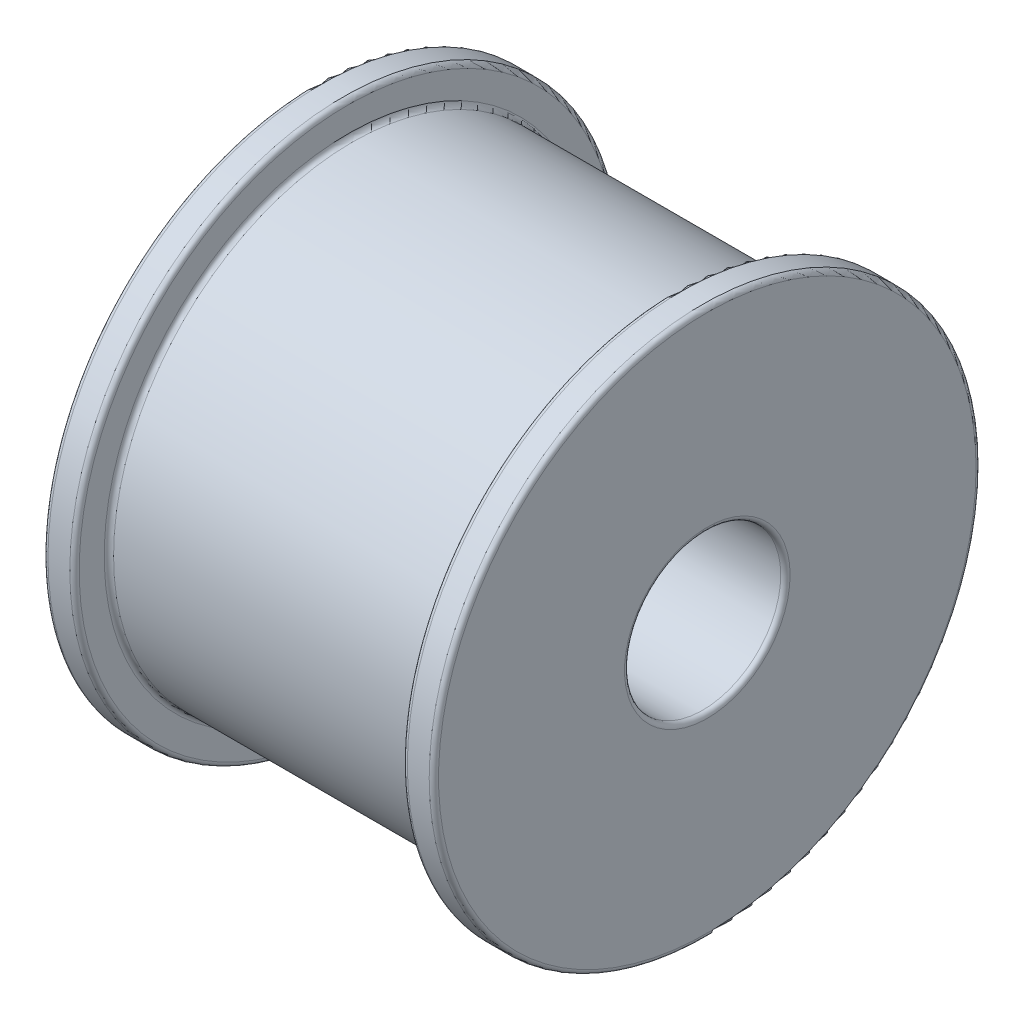
ISO-10303-21;
HEADER;
FILE_DESCRIPTION(('STEP AP214'),'2;1');
FILE_NAME('part.step','',(''),(''),'','','');
FILE_SCHEMA(('AUTOMOTIVE_DESIGN { 1 0 10303 214 1 1 1 1 }'));
ENDSEC;
DATA;
#1=APPLICATION_CONTEXT('core data for automotive mechanical design processes');
#2=APPLICATION_PROTOCOL_DEFINITION('international standard','automotive_design',2000,#1);
#3=PRODUCT_CONTEXT('',#1,'mechanical');
#4=PRODUCT('Part','Part','',(#3));
#5=PRODUCT_RELATED_PRODUCT_CATEGORY('part','',(#4));
#6=PRODUCT_DEFINITION_FORMATION('','',#4);
#7=PRODUCT_DEFINITION_CONTEXT('part definition',#1,'design');
#8=PRODUCT_DEFINITION('design','',#6,#7);
#9=PRODUCT_DEFINITION_SHAPE('','',#8);
#10=(LENGTH_UNIT() NAMED_UNIT(*) SI_UNIT(.MILLI.,.METRE.));
#11=(NAMED_UNIT(*) PLANE_ANGLE_UNIT() SI_UNIT($,.RADIAN.));
#12=(NAMED_UNIT(*) SI_UNIT($,.STERADIAN.) SOLID_ANGLE_UNIT());
#13=UNCERTAINTY_MEASURE_WITH_UNIT(LENGTH_MEASURE(1.E-05),#10,'distance_accuracy_value','');
#14=(GEOMETRIC_REPRESENTATION_CONTEXT(3) GLOBAL_UNCERTAINTY_ASSIGNED_CONTEXT((#13)) GLOBAL_UNIT_ASSIGNED_CONTEXT((#10,
#11,#12)) REPRESENTATION_CONTEXT('',''));
#15=CARTESIAN_POINT('',(0.,0.,0.));
#16=DIRECTION('',(0.,0.,1.));
#17=DIRECTION('',(1.,0.,0.));
#18=AXIS2_PLACEMENT_3D('',#15,#16,#17);
#19=CARTESIAN_POINT('',(2.,0.,0.));
#20=DIRECTION('',(-1.,0.,0.));
#21=DIRECTION('',(0.,0.,1.));
#22=AXIS2_PLACEMENT_3D('',#19,#20,#21);
#23=CYLINDRICAL_SURFACE('',#22,17.5);
#24=CARTESIAN_POINT('',(1.7,0.,0.));
#25=DIRECTION('',(1.,0.,0.));
#26=DIRECTION('',(0.,0.,-1.));
#27=AXIS2_PLACEMENT_3D('',#24,#25,#26);
#28=CIRCLE('',#27,17.5);
#29=CARTESIAN_POINT('',(1.7,0.,-17.5));
#30=VERTEX_POINT('',#29);
#31=EDGE_CURVE('E10',#30,#30,#28,.F.);
#32=ORIENTED_EDGE('',*,*,#31,.T.);
#33=EDGE_LOOP('',(#32));
#34=FACE_BOUND('',#33,.T.);
#35=CARTESIAN_POINT('',(0.3,0.,0.));
#36=DIRECTION('',(1.,0.,0.));
#37=DIRECTION('',(0.,0.,-1.));
#38=AXIS2_PLACEMENT_3D('',#35,#36,#37);
#39=CIRCLE('',#38,17.5);
#40=CARTESIAN_POINT('',(0.3,0.,-17.5));
#41=VERTEX_POINT('',#40);
#42=EDGE_CURVE('E41',#41,#41,#39,.T.);
#43=ORIENTED_EDGE('',*,*,#42,.T.);
#44=EDGE_LOOP('',(#43));
#45=FACE_BOUND('',#44,.T.);
#46=ADVANCED_FACE('F34',(#34,#45),#23,.T.);
#47=CARTESIAN_POINT('',(2.,0.,0.));
#48=DIRECTION('',(1.,0.,0.));
#49=DIRECTION('',(0.,0.,-1.));
#50=AXIS2_PLACEMENT_3D('',#47,#48,#49);
#51=PLANE('',#50);
#52=CARTESIAN_POINT('',(2.,0.,0.));
#53=DIRECTION('',(1.,0.,0.));
#54=DIRECTION('',(0.,0.,-1.));
#55=AXIS2_PLACEMENT_3D('',#52,#53,#54);
#56=CIRCLE('',#55,15.6);
#57=CARTESIAN_POINT('',(2.,0.,-15.6));
#58=VERTEX_POINT('',#57);
#59=EDGE_CURVE('E78',#58,#58,#56,.F.);
#60=ORIENTED_EDGE('',*,*,#59,.T.);
#61=EDGE_LOOP('',(#60));
#62=FACE_BOUND('',#61,.T.);
#63=CARTESIAN_POINT('',(2.,0.,0.));
#64=DIRECTION('',(1.,0.,0.));
#65=DIRECTION('',(0.,0.,-1.));
#66=AXIS2_PLACEMENT_3D('',#63,#64,#65);
#67=CIRCLE('',#66,17.2);
#68=CARTESIAN_POINT('',(2.,0.,-17.2));
#69=VERTEX_POINT('',#68);
#70=EDGE_CURVE('E81',#69,#69,#67,.T.);
#71=ORIENTED_EDGE('',*,*,#70,.T.);
#72=EDGE_LOOP('',(#71));
#73=FACE_BOUND('',#72,.T.);
#74=ADVANCED_FACE('F131',(#62,#73),#51,.T.);
#75=CARTESIAN_POINT('',(0.,0.,0.));
#76=DIRECTION('',(1.,0.,0.));
#77=DIRECTION('',(0.,0.,-1.));
#78=AXIS2_PLACEMENT_3D('',#75,#76,#77);
#79=PLANE('',#78);
#80=CARTESIAN_POINT('',(0.,0.,0.));
#81=DIRECTION('',(1.,0.,0.));
#82=DIRECTION('',(0.,0.,-1.));
#83=AXIS2_PLACEMENT_3D('',#80,#81,#82);
#84=CIRCLE('',#83,5.3);
#85=CARTESIAN_POINT('',(0.,0.,-5.3));
#86=VERTEX_POINT('',#85);
#87=EDGE_CURVE('E66',#86,#86,#84,.T.);
#88=ORIENTED_EDGE('',*,*,#87,.T.);
#89=EDGE_LOOP('',(#88));
#90=FACE_BOUND('',#89,.T.);
#91=CARTESIAN_POINT('',(0.,0.,0.));
#92=DIRECTION('',(1.,0.,0.));
#93=DIRECTION('',(0.,0.,-1.));
#94=AXIS2_PLACEMENT_3D('',#91,#92,#93);
#95=CIRCLE('',#94,17.2);
#96=CARTESIAN_POINT('',(0.,0.,-17.2));
#97=VERTEX_POINT('',#96);
#98=EDGE_CURVE('E69',#97,#97,#95,.F.);
#99=ORIENTED_EDGE('',*,*,#98,.T.);
#100=EDGE_LOOP('',(#99));
#101=FACE_BOUND('',#100,.T.);
#102=ADVANCED_FACE('F127',(#90,#101),#79,.F.);
#103=CARTESIAN_POINT('',(23.,0.,0.));
#104=DIRECTION('',(-1.,0.,0.));
#105=DIRECTION('',(0.,0.,1.));
#106=AXIS2_PLACEMENT_3D('',#103,#104,#105);
#107=CYLINDRICAL_SURFACE('',#106,15.3);
#108=CARTESIAN_POINT('',(2.3,0.,0.));
#109=DIRECTION('',(1.,0.,0.));
#110=DIRECTION('',(0.,0.,-1.));
#111=AXIS2_PLACEMENT_3D('',#108,#109,#110);
#112=CIRCLE('',#111,15.3);
#113=CARTESIAN_POINT('',(2.3,0.,15.3));
#114=VERTEX_POINT('',#113);
#115=EDGE_CURVE('E84',#114,#114,#112,.T.);
#116=CARTESIAN_POINT('',(22.7,0.,0.));
#117=DIRECTION('',(1.,0.,0.));
#118=DIRECTION('',(0.,0.,-1.));
#119=AXIS2_PLACEMENT_3D('',#116,#117,#118);
#120=CIRCLE('',#119,15.3);
#121=CARTESIAN_POINT('',(22.7,0.,15.3));
#122=VERTEX_POINT('',#121);
#123=EDGE_CURVE('E87',#122,#122,#120,.F.);
#124=CARTESIAN_POINT('',(2.3,0.,15.3));
#125=CARTESIAN_POINT('',(2.5125,0.,15.3));
#126=CARTESIAN_POINT('',(2.725,0.,15.3));
#127=CARTESIAN_POINT('',(3.15,0.,15.3));
#128=CARTESIAN_POINT('',(3.3625,0.,15.3));
#129=CARTESIAN_POINT('',(3.7875,0.,15.3));
#130=CARTESIAN_POINT('',(4.,0.,15.3));
#131=CARTESIAN_POINT('',(4.425,0.,15.3));
#132=CARTESIAN_POINT('',(4.6375,0.,15.3));
#133=CARTESIAN_POINT('',(5.0625,0.,15.3));
#134=CARTESIAN_POINT('',(5.275,0.,15.3));
#135=CARTESIAN_POINT('',(5.7,0.,15.3));
#136=CARTESIAN_POINT('',(5.9125,0.,15.3));
#137=CARTESIAN_POINT('',(6.3375,0.,15.3));
#138=CARTESIAN_POINT('',(6.55,0.,15.3));
#139=CARTESIAN_POINT('',(6.975,0.,15.3));
#140=CARTESIAN_POINT('',(7.1875,0.,15.3));
#141=CARTESIAN_POINT('',(7.6125,0.,15.3));
#142=CARTESIAN_POINT('',(7.825,0.,15.3));
#143=CARTESIAN_POINT('',(8.25,0.,15.3));
#144=CARTESIAN_POINT('',(8.4625,0.,15.3));
#145=CARTESIAN_POINT('',(8.8875,0.,15.3));
#146=CARTESIAN_POINT('',(9.1,0.,15.3));
#147=CARTESIAN_POINT('',(9.525,0.,15.3));
#148=CARTESIAN_POINT('',(9.7375,0.,15.3));
#149=CARTESIAN_POINT('',(10.1625,0.,15.3));
#150=CARTESIAN_POINT('',(10.375,0.,15.3));
#151=CARTESIAN_POINT('',(10.8,0.,15.3));
#152=CARTESIAN_POINT('',(11.0125,0.,15.3));
#153=CARTESIAN_POINT('',(11.4375,0.,15.3));
#154=CARTESIAN_POINT('',(11.65,0.,15.3));
#155=CARTESIAN_POINT('',(12.075,0.,15.3));
#156=CARTESIAN_POINT('',(12.2875,0.,15.3));
#157=CARTESIAN_POINT('',(12.7125,0.,15.3));
#158=CARTESIAN_POINT('',(12.925,0.,15.3));
#159=CARTESIAN_POINT('',(13.35,0.,15.3));
#160=CARTESIAN_POINT('',(13.5625,0.,15.3));
#161=CARTESIAN_POINT('',(13.9875,0.,15.3));
#162=CARTESIAN_POINT('',(14.2,0.,15.3));
#163=CARTESIAN_POINT('',(14.625,0.,15.3));
#164=CARTESIAN_POINT('',(14.8375,0.,15.3));
#165=CARTESIAN_POINT('',(15.2625,0.,15.3));
#166=CARTESIAN_POINT('',(15.475,0.,15.3));
#167=CARTESIAN_POINT('',(15.9,0.,15.3));
#168=CARTESIAN_POINT('',(16.1125,0.,15.3));
#169=CARTESIAN_POINT('',(16.5375,0.,15.3));
#170=CARTESIAN_POINT('',(16.75,0.,15.3));
#171=CARTESIAN_POINT('',(17.175,0.,15.3));
#172=CARTESIAN_POINT('',(17.3875,0.,15.3));
#173=CARTESIAN_POINT('',(17.8125,0.,15.3));
#174=CARTESIAN_POINT('',(18.025,0.,15.3));
#175=CARTESIAN_POINT('',(18.45,0.,15.3));
#176=CARTESIAN_POINT('',(18.6625,0.,15.3));
#177=CARTESIAN_POINT('',(19.0875,0.,15.3));
#178=CARTESIAN_POINT('',(19.3,0.,15.3));
#179=CARTESIAN_POINT('',(19.725,0.,15.3));
#180=CARTESIAN_POINT('',(19.9375,0.,15.3));
#181=CARTESIAN_POINT('',(20.3625,0.,15.3));
#182=CARTESIAN_POINT('',(20.575,0.,15.3));
#183=CARTESIAN_POINT('',(21.,0.,15.3));
#184=CARTESIAN_POINT('',(21.2125,0.,15.3));
#185=CARTESIAN_POINT('',(21.6375,0.,15.3));
#186=CARTESIAN_POINT('',(21.85,0.,15.3));
#187=CARTESIAN_POINT('',(22.275,0.,15.3));
#188=CARTESIAN_POINT('',(22.4875,0.,15.3));
#189=CARTESIAN_POINT('',(22.7,0.,15.3));
#190=B_SPLINE_CURVE_WITH_KNOTS('',3,(#124,#125,#126,#127,#128,#129,#130,#131,#132,#133,#134,
#135,#136,#137,#138,#139,#140,#141,#142,#143,#144,#145,#146,#147,#148,#149,#150,#151,#152,#153,
#154,#155,#156,#157,#158,#159,#160,#161,#162,#163,#164,#165,#166,#167,#168,#169,#170,#171,#172,
#173,#174,#175,#176,#177,#178,#179,#180,#181,#182,#183,#184,#185,#186,#187,#188,#189),
.UNSPECIFIED.,.F.,.F.,(4,2,2,2,2,2,2,2,2,2,2,2,2,2,2,2,2,2,2,2,2,2,2,2,2,2,2,2,2,2,2,2,4),(0.,
0.637499999999999,1.275,1.9125,2.55,3.1875,3.825,4.4625,5.1,5.7375,6.375,7.0125,7.65,8.2875,
8.925,9.5625,10.2,10.8375,11.475,12.1125,12.75,13.3875,14.025,14.6625,15.3,15.9375,16.575,
17.2125,17.85,18.4875,19.125,19.7625,20.4),.UNSPECIFIED.);
#191=EDGE_CURVE('BSEAM91',#114,#122,#190,.T.);
#192=ORIENTED_EDGE('',*,*,#115,.T.);
#193=ORIENTED_EDGE('',*,*,#123,.T.);
#194=ORIENTED_EDGE('',*,*,#191,.T.);
#195=ORIENTED_EDGE('',*,*,#191,.F.);
#196=EDGE_LOOP('',(#192,#194,#193,#195));
#197=FACE_BOUND('',#196,.T.);
#198=ADVANCED_FACE('F91',(#197),#107,.T.);
#199=CARTESIAN_POINT('',(25.,0.,0.));
#200=DIRECTION('',(-1.,0.,0.));
#201=DIRECTION('',(0.,0.,1.));
#202=AXIS2_PLACEMENT_3D('',#199,#200,#201);
#203=CYLINDRICAL_SURFACE('',#202,17.5);
#204=CARTESIAN_POINT('',(24.7,0.,0.));
#205=DIRECTION('',(1.,0.,0.));
#206=DIRECTION('',(0.,0.,-1.));
#207=AXIS2_PLACEMENT_3D('',#204,#205,#206);
#208=CIRCLE('',#207,17.5);
#209=CARTESIAN_POINT('',(24.7,0.,-17.5));
#210=VERTEX_POINT('',#209);
#211=EDGE_CURVE('E45',#210,#210,#208,.F.);
#212=ORIENTED_EDGE('',*,*,#211,.T.);
#213=EDGE_LOOP('',(#212));
#214=FACE_BOUND('',#213,.T.);
#215=CARTESIAN_POINT('',(23.3,0.,0.));
#216=DIRECTION('',(1.,0.,0.));
#217=DIRECTION('',(0.,0.,-1.));
#218=AXIS2_PLACEMENT_3D('',#215,#216,#217);
#219=CIRCLE('',#218,17.5);
#220=CARTESIAN_POINT('',(23.3,0.,-17.5));
#221=VERTEX_POINT('',#220);
#222=EDGE_CURVE('E49',#221,#221,#219,.T.);
#223=ORIENTED_EDGE('',*,*,#222,.T.);
#224=EDGE_LOOP('',(#223));
#225=FACE_BOUND('',#224,.T.);
#226=ADVANCED_FACE('F117',(#214,#225),#203,.T.);
#227=CARTESIAN_POINT('',(25.,0.,0.));
#228=DIRECTION('',(1.,0.,0.));
#229=DIRECTION('',(0.,0.,-1.));
#230=AXIS2_PLACEMENT_3D('',#227,#228,#229);
#231=PLANE('',#230);
#232=CARTESIAN_POINT('',(25.,0.,0.));
#233=DIRECTION('',(1.,0.,0.));
#234=DIRECTION('',(0.,0.,-1.));
#235=AXIS2_PLACEMENT_3D('',#232,#233,#234);
#236=CIRCLE('',#235,5.3);
#237=CARTESIAN_POINT('',(25.,0.,-5.3));
#238=VERTEX_POINT('',#237);
#239=EDGE_CURVE('E54',#238,#238,#236,.F.);
#240=ORIENTED_EDGE('',*,*,#239,.T.);
#241=EDGE_LOOP('',(#240));
#242=FACE_BOUND('',#241,.T.);
#243=CARTESIAN_POINT('',(25.,0.,0.));
#244=DIRECTION('',(1.,0.,0.));
#245=DIRECTION('',(0.,0.,-1.));
#246=AXIS2_PLACEMENT_3D('',#243,#244,#245);
#247=CIRCLE('',#246,17.2);
#248=CARTESIAN_POINT('',(25.,0.,-17.2));
#249=VERTEX_POINT('',#248);
#250=EDGE_CURVE('E57',#249,#249,#247,.T.);
#251=ORIENTED_EDGE('',*,*,#250,.T.);
#252=EDGE_LOOP('',(#251));
#253=FACE_BOUND('',#252,.T.);
#254=ADVANCED_FACE('F105',(#242,#253),#231,.T.);
#255=CARTESIAN_POINT('',(23.,0.,0.));
#256=DIRECTION('',(1.,0.,0.));
#257=DIRECTION('',(0.,0.,-1.));
#258=AXIS2_PLACEMENT_3D('',#255,#256,#257);
#259=PLANE('',#258);
#260=CARTESIAN_POINT('',(23.,0.,0.));
#261=DIRECTION('',(1.,0.,0.));
#262=DIRECTION('',(0.,0.,-1.));
#263=AXIS2_PLACEMENT_3D('',#260,#261,#262);
#264=CIRCLE('',#263,15.6);
#265=CARTESIAN_POINT('',(23.,0.,-15.6));
#266=VERTEX_POINT('',#265);
#267=EDGE_CURVE('E72',#266,#266,#264,.T.);
#268=ORIENTED_EDGE('',*,*,#267,.T.);
#269=EDGE_LOOP('',(#268));
#270=FACE_BOUND('',#269,.T.);
#271=CARTESIAN_POINT('',(23.,0.,0.));
#272=DIRECTION('',(1.,0.,0.));
#273=DIRECTION('',(0.,0.,-1.));
#274=AXIS2_PLACEMENT_3D('',#271,#272,#273);
#275=CIRCLE('',#274,17.2);
#276=CARTESIAN_POINT('',(23.,0.,-17.2));
#277=VERTEX_POINT('',#276);
#278=EDGE_CURVE('E75',#277,#277,#275,.F.);
#279=ORIENTED_EDGE('',*,*,#278,.T.);
#280=EDGE_LOOP('',(#279));
#281=FACE_BOUND('',#280,.T.);
#282=ADVANCED_FACE('F101',(#270,#281),#259,.F.);
#283=CARTESIAN_POINT('',(0.,0.,0.));
#284=DIRECTION('',(1.,0.,0.));
#285=DIRECTION('',(0.,0.,-1.));
#286=AXIS2_PLACEMENT_3D('',#283,#284,#285);
#287=CYLINDRICAL_SURFACE('',#286,5.);
#288=CARTESIAN_POINT('',(0.3,0.,0.));
#289=DIRECTION('',(1.,0.,0.));
#290=DIRECTION('',(0.,0.,-1.));
#291=AXIS2_PLACEMENT_3D('',#288,#289,#290);
#292=CIRCLE('',#291,5.);
#293=CARTESIAN_POINT('',(0.3,0.,-5.));
#294=VERTEX_POINT('',#293);
#295=EDGE_CURVE('E60',#294,#294,#292,.F.);
#296=ORIENTED_EDGE('',*,*,#295,.T.);
#297=EDGE_LOOP('',(#296));
#298=FACE_BOUND('',#297,.T.);
#299=CARTESIAN_POINT('',(24.7,0.,0.));
#300=DIRECTION('',(1.,0.,0.));
#301=DIRECTION('',(0.,0.,-1.));
#302=AXIS2_PLACEMENT_3D('',#299,#300,#301);
#303=CIRCLE('',#302,5.);
#304=CARTESIAN_POINT('',(24.7,0.,-5.));
#305=VERTEX_POINT('',#304);
#306=EDGE_CURVE('E63',#305,#305,#303,.T.);
#307=ORIENTED_EDGE('',*,*,#306,.T.);
#308=EDGE_LOOP('',(#307));
#309=FACE_BOUND('',#308,.T.);
#310=ADVANCED_FACE('F104',(#298,#309),#287,.F.);
#311=CARTESIAN_POINT('',(2.3,0.,0.));
#312=DIRECTION('',(1.,0.,0.));
#313=DIRECTION('',(0.,0.,-1.));
#314=AXIS2_PLACEMENT_3D('',#311,#312,#313);
#315=TOROIDAL_SURFACE('',#314,15.6,0.3);
#316=ORIENTED_EDGE('',*,*,#59,.F.);
#317=EDGE_LOOP('',(#316));
#318=FACE_BOUND('',#317,.T.);
#319=ORIENTED_EDGE('',*,*,#115,.F.);
#320=EDGE_LOOP('',(#319));
#321=FACE_BOUND('',#320,.T.);
#322=ADVANCED_FACE('F97',(#318,#321),#315,.F.);
#323=CARTESIAN_POINT('',(22.7,0.,0.));
#324=DIRECTION('',(1.,0.,0.));
#325=DIRECTION('',(0.,0.,-1.));
#326=AXIS2_PLACEMENT_3D('',#323,#324,#325);
#327=TOROIDAL_SURFACE('',#326,15.6,0.3);
#328=ORIENTED_EDGE('',*,*,#123,.F.);
#329=EDGE_LOOP('',(#328));
#330=FACE_BOUND('',#329,.T.);
#331=ORIENTED_EDGE('',*,*,#267,.F.);
#332=EDGE_LOOP('',(#331));
#333=FACE_BOUND('',#332,.T.);
#334=ADVANCED_FACE('F93',(#330,#333),#327,.F.);
#335=CARTESIAN_POINT('',(0.3,0.,0.));
#336=DIRECTION('',(1.,0.,0.));
#337=DIRECTION('',(0.,0.,-1.));
#338=AXIS2_PLACEMENT_3D('',#335,#336,#337);
#339=TOROIDAL_SURFACE('',#338,5.3,0.3);
#340=ORIENTED_EDGE('',*,*,#295,.F.);
#341=EDGE_LOOP('',(#340));
#342=FACE_BOUND('',#341,.T.);
#343=ORIENTED_EDGE('',*,*,#87,.F.);
#344=EDGE_LOOP('',(#343));
#345=FACE_BOUND('',#344,.T.);
#346=ADVANCED_FACE('F96',(#342,#345),#339,.T.);
#347=CARTESIAN_POINT('',(24.7,0.,0.));
#348=DIRECTION('',(1.,0.,0.));
#349=DIRECTION('',(0.,0.,-1.));
#350=AXIS2_PLACEMENT_3D('',#347,#348,#349);
#351=TOROIDAL_SURFACE('',#350,5.3,0.3);
#352=ORIENTED_EDGE('',*,*,#239,.F.);
#353=EDGE_LOOP('',(#352));
#354=FACE_BOUND('',#353,.T.);
#355=ORIENTED_EDGE('',*,*,#306,.F.);
#356=EDGE_LOOP('',(#355));
#357=FACE_BOUND('',#356,.T.);
#358=ADVANCED_FACE('F145',(#354,#357),#351,.T.);
#359=CARTESIAN_POINT('',(24.7,0.,0.));
#360=DIRECTION('',(1.,0.,0.));
#361=DIRECTION('',(0.,0.,-1.));
#362=AXIS2_PLACEMENT_3D('',#359,#360,#361);
#363=TOROIDAL_SURFACE('',#362,17.2,0.3);
#364=ORIENTED_EDGE('',*,*,#211,.F.);
#365=EDGE_LOOP('',(#364));
#366=FACE_BOUND('',#365,.T.);
#367=ORIENTED_EDGE('',*,*,#250,.F.);
#368=EDGE_LOOP('',(#367));
#369=FACE_BOUND('',#368,.T.);
#370=ADVANCED_FACE('F113',(#366,#369),#363,.T.);
#371=CARTESIAN_POINT('',(23.3,0.,0.));
#372=DIRECTION('',(1.,0.,0.));
#373=DIRECTION('',(0.,0.,-1.));
#374=AXIS2_PLACEMENT_3D('',#371,#372,#373);
#375=TOROIDAL_SURFACE('',#374,17.2,0.3);
#376=ORIENTED_EDGE('',*,*,#278,.F.);
#377=EDGE_LOOP('',(#376));
#378=FACE_BOUND('',#377,.T.);
#379=ORIENTED_EDGE('',*,*,#222,.F.);
#380=EDGE_LOOP('',(#379));
#381=FACE_BOUND('',#380,.T.);
#382=ADVANCED_FACE('F109',(#378,#381),#375,.T.);
#383=CARTESIAN_POINT('',(1.7,0.,0.));
#384=DIRECTION('',(1.,0.,0.));
#385=DIRECTION('',(0.,0.,-1.));
#386=AXIS2_PLACEMENT_3D('',#383,#384,#385);
#387=TOROIDAL_SURFACE('',#386,17.2,0.3);
#388=ORIENTED_EDGE('',*,*,#31,.F.);
#389=EDGE_LOOP('',(#388));
#390=FACE_BOUND('',#389,.T.);
#391=ORIENTED_EDGE('',*,*,#70,.F.);
#392=EDGE_LOOP('',(#391));
#393=FACE_BOUND('',#392,.T.);
#394=ADVANCED_FACE('F112',(#390,#393),#387,.T.);
#395=CARTESIAN_POINT('',(0.3,0.,0.));
#396=DIRECTION('',(1.,0.,0.));
#397=DIRECTION('',(0.,0.,-1.));
#398=AXIS2_PLACEMENT_3D('',#395,#396,#397);
#399=TOROIDAL_SURFACE('',#398,17.2,0.3);
#400=ORIENTED_EDGE('',*,*,#98,.F.);
#401=EDGE_LOOP('',(#400));
#402=FACE_BOUND('',#401,.T.);
#403=ORIENTED_EDGE('',*,*,#42,.F.);
#404=EDGE_LOOP('',(#403));
#405=FACE_BOUND('',#404,.T.);
#406=ADVANCED_FACE('F36',(#402,#405),#399,.T.);
#407=CLOSED_SHELL('',(#46,#74,#102,#198,#226,#254,#282,#310,#322,#334,#346,#358,#370,#382,#394,#406));
#408=MANIFOLD_SOLID_BREP('B2',#407);
#409=ADVANCED_BREP_SHAPE_REPRESENTATION('',(#18,#408),#14);
#410=SHAPE_DEFINITION_REPRESENTATION(#9,#409);
ENDSEC;
END-ISO-10303-21;
